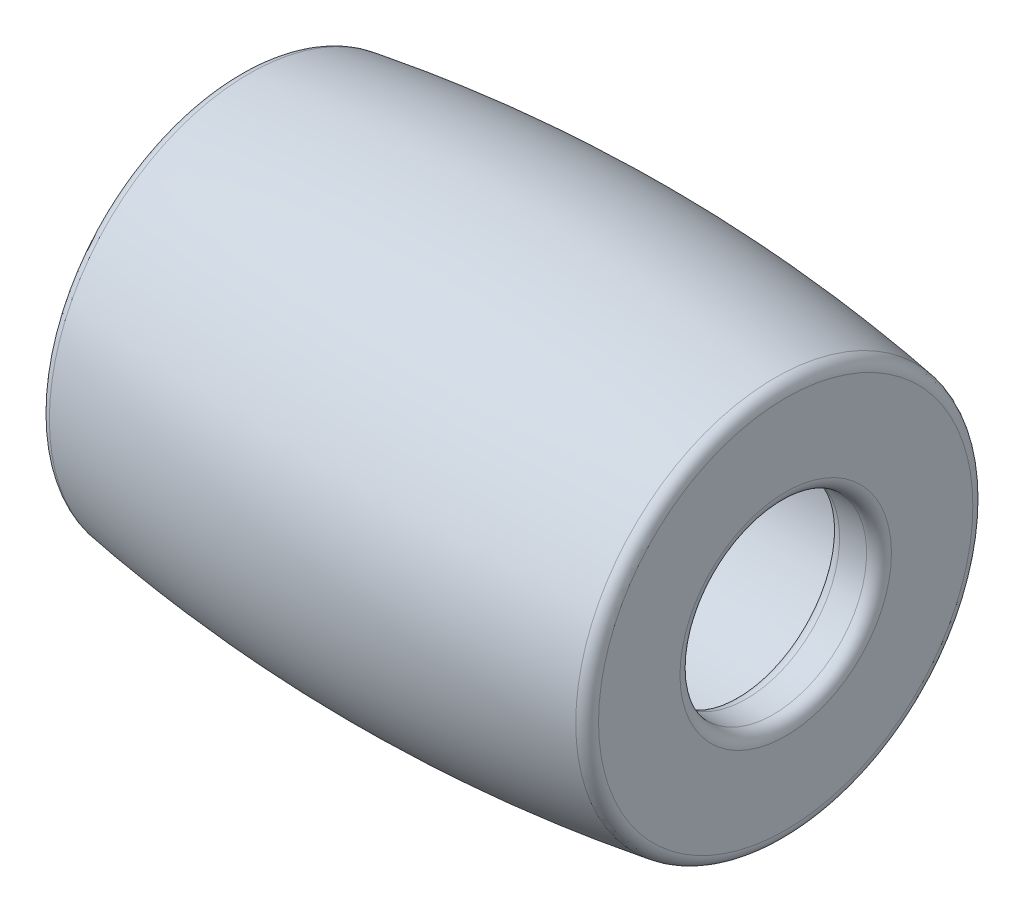
ISO-10303-21;
HEADER;
FILE_DESCRIPTION(('STEP AP214'),'2;1');
FILE_NAME('part.step','',(''),(''),'','','');
FILE_SCHEMA(('AUTOMOTIVE_DESIGN { 1 0 10303 214 1 1 1 1 }'));
ENDSEC;
DATA;
#1=APPLICATION_CONTEXT('core data for automotive mechanical design processes');
#2=APPLICATION_PROTOCOL_DEFINITION('international standard','automotive_design',2000,#1);
#3=PRODUCT_CONTEXT('',#1,'mechanical');
#4=PRODUCT('Part','Part','',(#3));
#5=PRODUCT_RELATED_PRODUCT_CATEGORY('part','',(#4));
#6=PRODUCT_DEFINITION_FORMATION('','',#4);
#7=PRODUCT_DEFINITION_CONTEXT('part definition',#1,'design');
#8=PRODUCT_DEFINITION('design','',#6,#7);
#9=PRODUCT_DEFINITION_SHAPE('','',#8);
#10=(LENGTH_UNIT() NAMED_UNIT(*) SI_UNIT(.MILLI.,.METRE.));
#11=(NAMED_UNIT(*) PLANE_ANGLE_UNIT() SI_UNIT($,.RADIAN.));
#12=(NAMED_UNIT(*) SI_UNIT($,.STERADIAN.) SOLID_ANGLE_UNIT());
#13=UNCERTAINTY_MEASURE_WITH_UNIT(LENGTH_MEASURE(1.E-05),#10,'distance_accuracy_value','');
#14=(GEOMETRIC_REPRESENTATION_CONTEXT(3) GLOBAL_UNCERTAINTY_ASSIGNED_CONTEXT((#13)) GLOBAL_UNIT_ASSIGNED_CONTEXT((#10,
#11,#12)) REPRESENTATION_CONTEXT('',''));
#15=CARTESIAN_POINT('',(0.,0.,0.));
#16=DIRECTION('',(0.,0.,1.));
#17=DIRECTION('',(1.,0.,0.));
#18=AXIS2_PLACEMENT_3D('',#15,#16,#17);
#19=CARTESIAN_POINT('',(-10.2003086528256,0.,0.));
#20=DIRECTION('',(-1.,0.,0.));
#21=DIRECTION('',(0.,0.,1.));
#22=AXIS2_PLACEMENT_3D('',#19,#20,#21);
#23=CYLINDRICAL_SURFACE('',#22,3.06);
#24=CARTESIAN_POINT('',(-5.05,0.,0.));
#25=DIRECTION('',(-1.,0.,0.));
#26=DIRECTION('',(0.,0.,1.));
#27=AXIS2_PLACEMENT_3D('',#24,#25,#26);
#28=CIRCLE('',#27,3.06);
#29=CARTESIAN_POINT('',(-5.05,0.,3.06));
#30=VERTEX_POINT('',#29);
#31=EDGE_CURVE('E93',#30,#30,#28,.T.);
#32=ORIENTED_EDGE('',*,*,#31,.T.);
#33=EDGE_LOOP('',(#32));
#34=FACE_BOUND('',#33,.T.);
#35=CARTESIAN_POINT('',(5.05,0.,0.));
#36=DIRECTION('',(1.,0.,0.));
#37=DIRECTION('',(0.,0.,-1.));
#38=AXIS2_PLACEMENT_3D('',#35,#36,#37);
#39=CIRCLE('',#38,3.06);
#40=CARTESIAN_POINT('',(5.05,0.,-3.06));
#41=VERTEX_POINT('',#40);
#42=EDGE_CURVE('E455',#41,#41,#39,.T.);
#43=ORIENTED_EDGE('',*,*,#42,.T.);
#44=EDGE_LOOP('',(#43));
#45=FACE_BOUND('',#44,.T.);
#46=ADVANCED_FACE('F17',(#34,#45),#23,.F.);
#47=CARTESIAN_POINT('',(5.05,0.,0.));
#48=DIRECTION('',(1.,0.,0.));
#49=DIRECTION('',(0.,0.,-1.));
#50=AXIS2_PLACEMENT_3D('',#47,#48,#49);
#51=TOROIDAL_SURFACE('',#50,2.76,0.3);
#52=CARTESIAN_POINT('',(5.35,0.,0.));
#53=DIRECTION('',(1.,0.,0.));
#54=DIRECTION('',(0.,0.,1.));
#55=AXIS2_PLACEMENT_3D('',#52,#53,#54);
#56=CIRCLE('',#55,2.76);
#57=CARTESIAN_POINT('',(5.35,0.,2.76));
#58=VERTEX_POINT('',#57);
#59=CARTESIAN_POINT('',(5.35,0.,-2.76));
#60=VERTEX_POINT('',#59);
#61=EDGE_CURVE('E82',#58,#60,#56,.T.);
#62=ORIENTED_EDGE('',*,*,#61,.T.);
#63=CARTESIAN_POINT('',(5.35,0.,0.));
#64=DIRECTION('',(1.,0.,0.));
#65=DIRECTION('',(0.,0.,-1.));
#66=AXIS2_PLACEMENT_3D('',#63,#64,#65);
#67=CIRCLE('',#66,2.76);
#68=EDGE_CURVE('E80',#60,#58,#67,.T.);
#69=ORIENTED_EDGE('',*,*,#68,.T.);
#70=EDGE_LOOP('',(#62,#69));
#71=FACE_BOUND('',#70,.T.);
#72=ORIENTED_EDGE('',*,*,#42,.F.);
#73=EDGE_LOOP('',(#72));
#74=FACE_BOUND('',#73,.T.);
#75=ADVANCED_FACE('F84',(#71,#74),#51,.F.);
#76=CARTESIAN_POINT('',(-5.05,0.,0.));
#77=DIRECTION('',(-1.,0.,0.));
#78=DIRECTION('',(0.,0.,1.));
#79=AXIS2_PLACEMENT_3D('',#76,#77,#78);
#80=TOROIDAL_SURFACE('',#79,2.76,0.3);
#81=CARTESIAN_POINT('',(-5.35,0.,0.));
#82=DIRECTION('',(-1.,0.,0.));
#83=DIRECTION('',(0.,0.,-1.));
#84=AXIS2_PLACEMENT_3D('',#81,#82,#83);
#85=CIRCLE('',#84,2.76);
#86=CARTESIAN_POINT('',(-5.35,0.,-2.76));
#87=VERTEX_POINT('',#86);
#88=CARTESIAN_POINT('',(-5.35,0.,2.76));
#89=VERTEX_POINT('',#88);
#90=EDGE_CURVE('E184',#87,#89,#85,.T.);
#91=ORIENTED_EDGE('',*,*,#90,.T.);
#92=CARTESIAN_POINT('',(-5.35,0.,0.));
#93=DIRECTION('',(-1.,0.,0.));
#94=DIRECTION('',(0.,0.,1.));
#95=AXIS2_PLACEMENT_3D('',#92,#93,#94);
#96=CIRCLE('',#95,2.76);
#97=EDGE_CURVE('E88',#89,#87,#96,.T.);
#98=ORIENTED_EDGE('',*,*,#97,.T.);
#99=EDGE_LOOP('',(#91,#98));
#100=FACE_BOUND('',#99,.T.);
#101=ORIENTED_EDGE('',*,*,#31,.F.);
#102=EDGE_LOOP('',(#101));
#103=FACE_BOUND('',#102,.T.);
#104=ADVANCED_FACE('F114',(#100,#103),#80,.F.);
#105=CARTESIAN_POINT('',(5.35,3.06,0.));
#106=DIRECTION('',(1.,0.,0.));
#107=DIRECTION('',(0.,0.,-1.));
#108=AXIS2_PLACEMENT_3D('',#105,#106,#107);
#109=PLANE('',#108);
#110=CARTESIAN_POINT('',(5.35,0.,0.));
#111=DIRECTION('',(-1.,0.,0.));
#112=DIRECTION('',(0.,0.,-1.));
#113=AXIS2_PLACEMENT_3D('',#110,#111,#112);
#114=CIRCLE('',#113,2.55);
#115=CARTESIAN_POINT('',(5.35,0.,-2.55));
#116=VERTEX_POINT('',#115);
#117=CARTESIAN_POINT('',(5.35,0.,2.55));
#118=VERTEX_POINT('',#117);
#119=EDGE_CURVE('E220',#116,#118,#114,.T.);
#120=ORIENTED_EDGE('',*,*,#119,.F.);
#121=CARTESIAN_POINT('',(5.35,0.,0.));
#122=DIRECTION('',(-1.,0.,0.));
#123=DIRECTION('',(0.,0.,1.));
#124=AXIS2_PLACEMENT_3D('',#121,#122,#123);
#125=CIRCLE('',#124,2.55);
#126=EDGE_CURVE('E138',#118,#116,#125,.T.);
#127=ORIENTED_EDGE('',*,*,#126,.F.);
#128=EDGE_LOOP('',(#120,#127));
#129=FACE_BOUND('',#128,.T.);
#130=ORIENTED_EDGE('',*,*,#68,.F.);
#131=ORIENTED_EDGE('',*,*,#61,.F.);
#132=EDGE_LOOP('',(#130,#131));
#133=FACE_BOUND('',#132,.T.);
#134=ADVANCED_FACE('F92',(#129,#133),#109,.F.);
#135=CARTESIAN_POINT('',(-5.35,3.06,0.));
#136=DIRECTION('',(-1.,0.,0.));
#137=DIRECTION('',(0.,0.,1.));
#138=AXIS2_PLACEMENT_3D('',#135,#136,#137);
#139=PLANE('',#138);
#140=CARTESIAN_POINT('',(-5.35,0.,0.));
#141=DIRECTION('',(1.,0.,0.));
#142=DIRECTION('',(0.,0.,1.));
#143=AXIS2_PLACEMENT_3D('',#140,#141,#142);
#144=CIRCLE('',#143,2.55);
#145=CARTESIAN_POINT('',(-5.35,0.,2.55));
#146=VERTEX_POINT('',#145);
#147=CARTESIAN_POINT('',(-5.35,0.,-2.55));
#148=VERTEX_POINT('',#147);
#149=EDGE_CURVE('E196',#146,#148,#144,.T.);
#150=ORIENTED_EDGE('',*,*,#149,.F.);
#151=CARTESIAN_POINT('',(-5.35,0.,0.));
#152=DIRECTION('',(1.,0.,0.));
#153=DIRECTION('',(0.,0.,-1.));
#154=AXIS2_PLACEMENT_3D('',#151,#152,#153);
#155=CIRCLE('',#154,2.55);
#156=EDGE_CURVE('E207',#148,#146,#155,.T.);
#157=ORIENTED_EDGE('',*,*,#156,.F.);
#158=EDGE_LOOP('',(#150,#157));
#159=FACE_BOUND('',#158,.T.);
#160=ORIENTED_EDGE('',*,*,#97,.F.);
#161=ORIENTED_EDGE('',*,*,#90,.F.);
#162=EDGE_LOOP('',(#160,#161));
#163=FACE_BOUND('',#162,.T.);
#164=ADVANCED_FACE('F113',(#159,#163),#139,.F.);
#165=CARTESIAN_POINT('',(5.65,0.,0.));
#166=DIRECTION('',(1.,0.,0.));
#167=DIRECTION('',(0.,0.,-1.));
#168=AXIS2_PLACEMENT_3D('',#165,#166,#167);
#169=TOROIDAL_SURFACE('',#168,2.55,0.3);
#170=ORIENTED_EDGE('',*,*,#119,.T.);
#171=ORIENTED_EDGE('',*,*,#126,.T.);
#172=EDGE_LOOP('',(#170,#171));
#173=FACE_BOUND('',#172,.T.);
#174=CARTESIAN_POINT('',(5.65,0.,0.));
#175=DIRECTION('',(-1.,0.,0.));
#176=DIRECTION('',(0.,0.,1.));
#177=AXIS2_PLACEMENT_3D('',#174,#175,#176);
#178=CIRCLE('',#177,2.25);
#179=CARTESIAN_POINT('',(5.65,0.,2.25));
#180=VERTEX_POINT('',#179);
#181=EDGE_CURVE('E170',#180,#180,#178,.F.);
#182=ORIENTED_EDGE('',*,*,#181,.T.);
#183=EDGE_LOOP('',(#182));
#184=FACE_BOUND('',#183,.T.);
#185=ADVANCED_FACE('F153',(#173,#184),#169,.T.);
#186=CARTESIAN_POINT('',(-5.65,0.,0.));
#187=DIRECTION('',(-1.,0.,0.));
#188=DIRECTION('',(0.,0.,1.));
#189=AXIS2_PLACEMENT_3D('',#186,#187,#188);
#190=TOROIDAL_SURFACE('',#189,2.55,0.3);
#191=ORIENTED_EDGE('',*,*,#149,.T.);
#192=ORIENTED_EDGE('',*,*,#156,.T.);
#193=EDGE_LOOP('',(#191,#192));
#194=FACE_BOUND('',#193,.T.);
#195=CARTESIAN_POINT('',(-5.65,0.,0.));
#196=DIRECTION('',(-1.,0.,0.));
#197=DIRECTION('',(0.,0.,1.));
#198=AXIS2_PLACEMENT_3D('',#195,#196,#197);
#199=CIRCLE('',#198,2.25);
#200=CARTESIAN_POINT('',(-5.65,0.,2.25));
#201=VERTEX_POINT('',#200);
#202=EDGE_CURVE('E219',#201,#201,#199,.T.);
#203=ORIENTED_EDGE('',*,*,#202,.T.);
#204=EDGE_LOOP('',(#203));
#205=FACE_BOUND('',#204,.T.);
#206=ADVANCED_FACE('F162',(#194,#205),#190,.T.);
#207=CARTESIAN_POINT('',(-10.2003086528256,0.,0.));
#208=DIRECTION('',(-1.,0.,0.));
#209=DIRECTION('',(0.,0.,1.));
#210=AXIS2_PLACEMENT_3D('',#207,#208,#209);
#211=CYLINDRICAL_SURFACE('',#210,2.25);
#212=CARTESIAN_POINT('',(6.3,0.,0.));
#213=DIRECTION('',(-1.,0.,0.));
#214=DIRECTION('',(0.,0.,1.));
#215=AXIS2_PLACEMENT_3D('',#212,#213,#214);
#216=CIRCLE('',#215,2.25);
#217=CARTESIAN_POINT('',(6.3,0.,2.25));
#218=VERTEX_POINT('',#217);
#219=EDGE_CURVE('E295',#218,#218,#216,.T.);
#220=ORIENTED_EDGE('',*,*,#219,.F.);
#221=EDGE_LOOP('',(#220));
#222=FACE_BOUND('',#221,.T.);
#223=ORIENTED_EDGE('',*,*,#181,.F.);
#224=EDGE_LOOP('',(#223));
#225=FACE_BOUND('',#224,.T.);
#226=ADVANCED_FACE('F304',(#222,#225),#211,.F.);
#227=CARTESIAN_POINT('',(-10.2003086528256,0.,0.));
#228=DIRECTION('',(-1.,0.,0.));
#229=DIRECTION('',(0.,0.,1.));
#230=AXIS2_PLACEMENT_3D('',#227,#228,#229);
#231=CYLINDRICAL_SURFACE('',#230,2.25);
#232=ORIENTED_EDGE('',*,*,#202,.F.);
#233=EDGE_LOOP('',(#232));
#234=FACE_BOUND('',#233,.T.);
#235=CARTESIAN_POINT('',(-6.3,0.,0.));
#236=DIRECTION('',(1.,0.,0.));
#237=DIRECTION('',(0.,0.,-1.));
#238=AXIS2_PLACEMENT_3D('',#235,#236,#237);
#239=CIRCLE('',#238,2.25);
#240=CARTESIAN_POINT('',(-6.3,0.,-2.25));
#241=VERTEX_POINT('',#240);
#242=EDGE_CURVE('E286',#241,#241,#239,.T.);
#243=ORIENTED_EDGE('',*,*,#242,.F.);
#244=EDGE_LOOP('',(#243));
#245=FACE_BOUND('',#244,.T.);
#246=ADVANCED_FACE('F267',(#234,#245),#231,.F.);
#247=CARTESIAN_POINT('',(6.3,0.,0.));
#248=DIRECTION('',(-1.,0.,0.));
#249=DIRECTION('',(0.,0.,1.));
#250=AXIS2_PLACEMENT_3D('',#247,#248,#249);
#251=TOROIDAL_SURFACE('',#250,2.55,0.3);
#252=CARTESIAN_POINT('',(6.6,0.,0.));
#253=DIRECTION('',(1.,0.,0.));
#254=DIRECTION('',(0.,0.,1.));
#255=AXIS2_PLACEMENT_3D('',#252,#253,#254);
#256=CIRCLE('',#255,2.55);
#257=CARTESIAN_POINT('',(6.6,0.,2.55));
#258=VERTEX_POINT('',#257);
#259=CARTESIAN_POINT('',(6.6,0.,-2.55));
#260=VERTEX_POINT('',#259);
#261=EDGE_CURVE('E294',#258,#260,#256,.T.);
#262=ORIENTED_EDGE('',*,*,#261,.T.);
#263=CARTESIAN_POINT('',(6.6,0.,0.));
#264=DIRECTION('',(1.,0.,0.));
#265=DIRECTION('',(0.,0.,-1.));
#266=AXIS2_PLACEMENT_3D('',#263,#264,#265);
#267=CIRCLE('',#266,2.55);
#268=EDGE_CURVE('E281',#260,#258,#267,.T.);
#269=ORIENTED_EDGE('',*,*,#268,.T.);
#270=EDGE_LOOP('',(#262,#269));
#271=FACE_BOUND('',#270,.T.);
#272=ORIENTED_EDGE('',*,*,#219,.T.);
#273=EDGE_LOOP('',(#272));
#274=FACE_BOUND('',#273,.T.);
#275=ADVANCED_FACE('F255',(#271,#274),#251,.T.);
#276=CARTESIAN_POINT('',(-6.3,0.,0.));
#277=DIRECTION('',(1.,0.,0.));
#278=DIRECTION('',(0.,0.,-1.));
#279=AXIS2_PLACEMENT_3D('',#276,#277,#278);
#280=TOROIDAL_SURFACE('',#279,2.55,0.3);
#281=CARTESIAN_POINT('',(-6.6,0.,0.));
#282=DIRECTION('',(-1.,0.,0.));
#283=DIRECTION('',(0.,0.,-1.));
#284=AXIS2_PLACEMENT_3D('',#281,#282,#283);
#285=CIRCLE('',#284,2.55);
#286=CARTESIAN_POINT('',(-6.6,0.,-2.55));
#287=VERTEX_POINT('',#286);
#288=CARTESIAN_POINT('',(-6.6,0.,2.55));
#289=VERTEX_POINT('',#288);
#290=EDGE_CURVE('E364',#287,#289,#285,.T.);
#291=ORIENTED_EDGE('',*,*,#290,.T.);
#292=CARTESIAN_POINT('',(-6.6,0.,0.));
#293=DIRECTION('',(-1.,0.,0.));
#294=DIRECTION('',(0.,0.,1.));
#295=AXIS2_PLACEMENT_3D('',#292,#293,#294);
#296=CIRCLE('',#295,2.55);
#297=EDGE_CURVE('E373',#289,#287,#296,.T.);
#298=ORIENTED_EDGE('',*,*,#297,.T.);
#299=EDGE_LOOP('',(#291,#298));
#300=FACE_BOUND('',#299,.T.);
#301=ORIENTED_EDGE('',*,*,#242,.T.);
#302=EDGE_LOOP('',(#301));
#303=FACE_BOUND('',#302,.T.);
#304=ADVANCED_FACE('F266',(#300,#303),#280,.T.);
#305=CARTESIAN_POINT('',(6.6,4.76890291810543,0.));
#306=DIRECTION('',(-1.,0.,0.));
#307=DIRECTION('',(0.,0.,1.));
#308=AXIS2_PLACEMENT_3D('',#305,#306,#307);
#309=PLANE('',#308);
#310=CARTESIAN_POINT('',(6.6,0.,0.));
#311=DIRECTION('',(-1.,0.,0.));
#312=DIRECTION('',(0.,0.,1.));
#313=AXIS2_PLACEMENT_3D('',#310,#311,#312);
#314=CIRCLE('',#313,4.51278365136822);
#315=CARTESIAN_POINT('',(6.6,0.,4.51278365136822));
#316=VERTEX_POINT('',#315);
#317=CARTESIAN_POINT('',(6.6,0.,-4.51278365136822));
#318=VERTEX_POINT('',#317);
#319=EDGE_CURVE('E452',#316,#318,#314,.T.);
#320=ORIENTED_EDGE('',*,*,#319,.F.);
#321=CARTESIAN_POINT('',(6.6,0.,0.));
#322=DIRECTION('',(-1.,0.,0.));
#323=DIRECTION('',(0.,0.,-1.));
#324=AXIS2_PLACEMENT_3D('',#321,#322,#323);
#325=CIRCLE('',#324,4.51278365136822);
#326=EDGE_CURVE('E376',#318,#316,#325,.T.);
#327=ORIENTED_EDGE('',*,*,#326,.F.);
#328=EDGE_LOOP('',(#320,#327));
#329=FACE_BOUND('',#328,.T.);
#330=ORIENTED_EDGE('',*,*,#261,.F.);
#331=ORIENTED_EDGE('',*,*,#268,.F.);
#332=EDGE_LOOP('',(#330,#331));
#333=FACE_BOUND('',#332,.T.);
#334=ADVANCED_FACE('F308',(#329,#333),#309,.F.);
#335=CARTESIAN_POINT('',(-6.6,4.76890291810543,0.));
#336=DIRECTION('',(1.,0.,0.));
#337=DIRECTION('',(0.,0.,-1.));
#338=AXIS2_PLACEMENT_3D('',#335,#336,#337);
#339=PLANE('',#338);
#340=CARTESIAN_POINT('',(-6.6,0.,0.));
#341=DIRECTION('',(1.,0.,0.));
#342=DIRECTION('',(0.,0.,-1.));
#343=AXIS2_PLACEMENT_3D('',#340,#341,#342);
#344=CIRCLE('',#343,4.51278365136822);
#345=CARTESIAN_POINT('',(-6.6,0.,-4.51278365136822));
#346=VERTEX_POINT('',#345);
#347=CARTESIAN_POINT('',(-6.6,0.,4.51278365136822));
#348=VERTEX_POINT('',#347);
#349=EDGE_CURVE('E335',#346,#348,#344,.T.);
#350=ORIENTED_EDGE('',*,*,#349,.F.);
#351=CARTESIAN_POINT('',(-6.6,0.,0.));
#352=DIRECTION('',(1.,0.,0.));
#353=DIRECTION('',(0.,0.,1.));
#354=AXIS2_PLACEMENT_3D('',#351,#352,#353);
#355=CIRCLE('',#354,4.51278365136822);
#356=EDGE_CURVE('E35',#348,#346,#355,.T.);
#357=ORIENTED_EDGE('',*,*,#356,.F.);
#358=EDGE_LOOP('',(#350,#357));
#359=FACE_BOUND('',#358,.T.);
#360=ORIENTED_EDGE('',*,*,#290,.F.);
#361=ORIENTED_EDGE('',*,*,#297,.F.);
#362=EDGE_LOOP('',(#360,#361));
#363=FACE_BOUND('',#362,.T.);
#364=ADVANCED_FACE('F314',(#359,#363),#339,.F.);
#365=CARTESIAN_POINT('',(6.3,0.,0.));
#366=DIRECTION('',(-1.,0.,0.));
#367=DIRECTION('',(0.,0.,1.));
#368=AXIS2_PLACEMENT_3D('',#365,#366,#367);
#369=TOROIDAL_SURFACE('',#368,4.51278365136822,0.3);
#370=CARTESIAN_POINT('',(6.34612568639415,0.,0.));
#371=DIRECTION('',(-1.,0.,0.));
#372=DIRECTION('',(0.,0.,1.));
#373=AXIS2_PLACEMENT_3D('',#370,#371,#372);
#374=CIRCLE('',#373,4.80921647858995);
#375=CARTESIAN_POINT('',(6.34612568639415,0.,4.80921647858995));
#376=VERTEX_POINT('',#375);
#377=EDGE_CURVE('E27',#376,#376,#374,.T.);
#378=ORIENTED_EDGE('',*,*,#377,.F.);
#379=EDGE_LOOP('',(#378));
#380=FACE_BOUND('',#379,.T.);
#381=ORIENTED_EDGE('',*,*,#319,.T.);
#382=ORIENTED_EDGE('',*,*,#326,.T.);
#383=EDGE_LOOP('',(#381,#382));
#384=FACE_BOUND('',#383,.T.);
#385=ADVANCED_FACE('F324',(#380,#384),#369,.T.);
#386=CARTESIAN_POINT('',(-6.3,0.,0.));
#387=DIRECTION('',(1.,0.,0.));
#388=DIRECTION('',(0.,0.,-1.));
#389=AXIS2_PLACEMENT_3D('',#386,#387,#388);
#390=TOROIDAL_SURFACE('',#389,4.51278365136822,0.3);
#391=CARTESIAN_POINT('',(-6.34612568639416,0.,0.));
#392=DIRECTION('',(-1.,0.,0.));
#393=DIRECTION('',(0.,0.,1.));
#394=AXIS2_PLACEMENT_3D('',#391,#392,#393);
#395=CIRCLE('',#394,4.80921647858995);
#396=CARTESIAN_POINT('',(-6.34612568639416,0.,4.80921647858995));
#397=VERTEX_POINT('',#396);
#398=EDGE_CURVE('E11',#397,#397,#395,.F.);
#399=ORIENTED_EDGE('',*,*,#398,.F.);
#400=EDGE_LOOP('',(#399));
#401=FACE_BOUND('',#400,.T.);
#402=ORIENTED_EDGE('',*,*,#349,.T.);
#403=ORIENTED_EDGE('',*,*,#356,.T.);
#404=EDGE_LOOP('',(#402,#403));
#405=FACE_BOUND('',#404,.T.);
#406=ADVANCED_FACE('F318',(#401,#405),#390,.T.);
#407=CARTESIAN_POINT('',(0.,0.,-35.975));
#408=DIRECTION('',(0.,1.,0.));
#409=DIRECTION('',(0.,0.,1.));
#410=AXIS2_PLACEMENT_3D('',#407,#408,#409);
#411=CIRCLE('',#410,41.275);
#412=TRIMMED_CURVE('',#411,(PARAMETER_VALUE(-0.51235389277956)),
(PARAMETER_VALUE(0.51235389277956)),.T.,.PARAMETER.);
#413=CARTESIAN_POINT('',(0.,0.,0.));
#414=DIRECTION('',(-1.,0.,0.));
#415=AXIS1_PLACEMENT('',#413,#414);
#416=SURFACE_OF_REVOLUTION('',#412,#415);
#417=ORIENTED_EDGE('',*,*,#398,.T.);
#418=EDGE_LOOP('',(#417));
#419=FACE_BOUND('',#418,.T.);
#420=ORIENTED_EDGE('',*,*,#377,.T.);
#421=EDGE_LOOP('',(#420));
#422=FACE_BOUND('',#421,.T.);
#423=ADVANCED_FACE('F316',(#419,#422),#416,.F.);
#424=CLOSED_SHELL('',(#46,#75,#104,#134,#164,#185,#206,#226,#246,#275,#304,#334,#364,#385,#406,#423));
#425=MANIFOLD_SOLID_BREP('B1',#424);
#426=ADVANCED_BREP_SHAPE_REPRESENTATION('',(#18,#425),#14);
#427=SHAPE_DEFINITION_REPRESENTATION(#9,#426);
ENDSEC;
END-ISO-10303-21;
